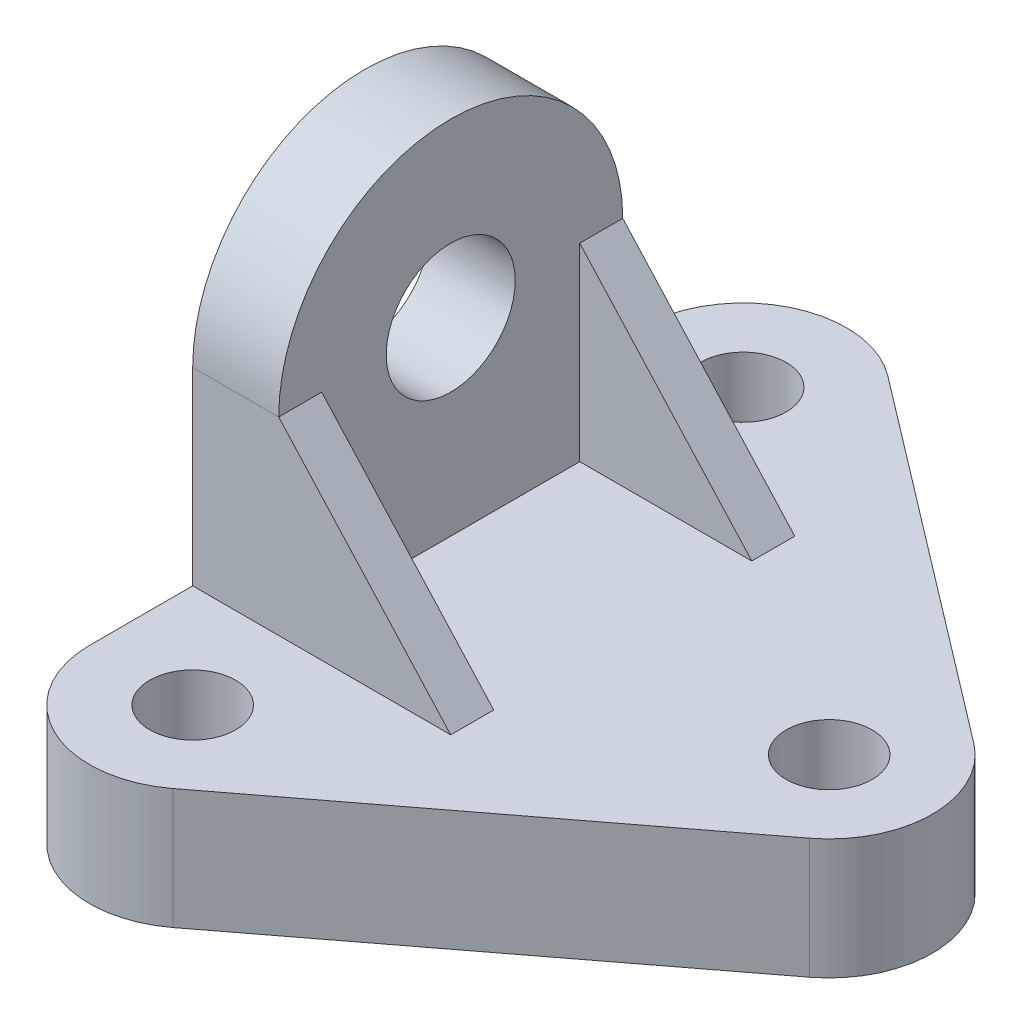
ISO-10303-21;
HEADER;
FILE_DESCRIPTION(('STEP AP214'),'2;1');
FILE_NAME('part.step','',(''),(''),'','','');
FILE_SCHEMA(('AUTOMOTIVE_DESIGN { 1 0 10303 214 1 1 1 1 }'));
ENDSEC;
DATA;
#1=APPLICATION_CONTEXT('core data for automotive mechanical design processes');
#2=APPLICATION_PROTOCOL_DEFINITION('international standard','automotive_design',2000,#1);
#3=PRODUCT_CONTEXT('',#1,'mechanical');
#4=PRODUCT('Part','Part','',(#3));
#5=PRODUCT_RELATED_PRODUCT_CATEGORY('part','',(#4));
#6=PRODUCT_DEFINITION_FORMATION('','',#4);
#7=PRODUCT_DEFINITION_CONTEXT('part definition',#1,'design');
#8=PRODUCT_DEFINITION('design','',#6,#7);
#9=PRODUCT_DEFINITION_SHAPE('','',#8);
#10=(LENGTH_UNIT() NAMED_UNIT(*) SI_UNIT(.MILLI.,.METRE.));
#11=(NAMED_UNIT(*) PLANE_ANGLE_UNIT() SI_UNIT($,.RADIAN.));
#12=(NAMED_UNIT(*) SI_UNIT($,.STERADIAN.) SOLID_ANGLE_UNIT());
#13=UNCERTAINTY_MEASURE_WITH_UNIT(LENGTH_MEASURE(1.E-05),#10,'distance_accuracy_value','');
#14=(GEOMETRIC_REPRESENTATION_CONTEXT(3) GLOBAL_UNCERTAINTY_ASSIGNED_CONTEXT((#13)) GLOBAL_UNIT_ASSIGNED_CONTEXT((#10,
#11,#12)) REPRESENTATION_CONTEXT('',''));
#15=CARTESIAN_POINT('',(0.,0.,0.));
#16=DIRECTION('',(0.,0.,1.));
#17=DIRECTION('',(1.,0.,0.));
#18=AXIS2_PLACEMENT_3D('',#15,#16,#17);
#19=CARTESIAN_POINT('',(-42.,14.,-32.));
#20=DIRECTION('',(0.,1.,0.));
#21=DIRECTION('',(0.,0.,1.));
#22=AXIS2_PLACEMENT_3D('',#19,#20,#21);
#23=PLANE('',#22);
#24=CARTESIAN_POINT('',(0.,14.,0.));
#25=DIRECTION('',(0.,1.,0.));
#26=DIRECTION('',(0.,0.,1.));
#27=AXIS2_PLACEMENT_3D('',#24,#25,#26);
#28=CIRCLE('',#27,5.);
#29=CARTESIAN_POINT('',(0.,14.,5.));
#30=VERTEX_POINT('',#29);
#31=EDGE_CURVE('E238',#30,#30,#28,.T.);
#32=ORIENTED_EDGE('',*,*,#31,.F.);
#33=EDGE_LOOP('',(#32));
#34=FACE_BOUND('',#33,.T.);
#35=CARTESIAN_POINT('',(-42.,14.,-32.));
#36=DIRECTION('',(0.,1.,0.));
#37=DIRECTION('',(0.,0.,1.));
#38=AXIS2_PLACEMENT_3D('',#35,#36,#37);
#39=CIRCLE('',#38,5.);
#40=CARTESIAN_POINT('',(-42.,14.,-27.));
#41=VERTEX_POINT('',#40);
#42=EDGE_CURVE('E246',#41,#41,#39,.T.);
#43=ORIENTED_EDGE('',*,*,#42,.F.);
#44=EDGE_LOOP('',(#43));
#45=FACE_BOUND('',#44,.T.);
#46=CARTESIAN_POINT('',(-42.,14.,32.));
#47=DIRECTION('',(0.,1.,0.));
#48=DIRECTION('',(0.,0.,1.));
#49=AXIS2_PLACEMENT_3D('',#46,#47,#48);
#50=CIRCLE('',#49,5.);
#51=CARTESIAN_POINT('',(-42.,14.,37.));
#52=VERTEX_POINT('',#51);
#53=EDGE_CURVE('E230',#52,#52,#50,.T.);
#54=ORIENTED_EDGE('',*,*,#53,.F.);
#55=EDGE_LOOP('',(#54));
#56=FACE_BOUND('',#55,.T.);
#57=DIRECTION('',(0.,0.,-1.));
#58=VECTOR('',#57,1.);
#59=CARTESIAN_POINT('',(-24.,14.,-15.));
#60=LINE('',#59,#58);
#61=CARTESIAN_POINT('',(-24.,14.,-15.));
#62=VERTEX_POINT('',#61);
#63=CARTESIAN_POINT('',(-24.,14.,-20.));
#64=VERTEX_POINT('',#63);
#65=EDGE_CURVE('E156',#62,#64,#60,.T.);
#66=ORIENTED_EDGE('',*,*,#65,.F.);
#67=DIRECTION('',(-1.,0.,0.));
#68=VECTOR('',#67,1.);
#69=CARTESIAN_POINT('',(-44.,14.,-15.));
#70=LINE('',#69,#68);
#71=CARTESIAN_POINT('',(-44.,14.,-15.));
#72=VERTEX_POINT('',#71);
#73=EDGE_CURVE('E143',#62,#72,#70,.T.);
#74=ORIENTED_EDGE('',*,*,#73,.T.);
#75=DIRECTION('',(0.,0.,-1.));
#76=VECTOR('',#75,1.);
#77=CARTESIAN_POINT('',(-44.,14.,-20.));
#78=LINE('',#77,#76);
#79=CARTESIAN_POINT('',(-44.,14.,15.));
#80=VERTEX_POINT('',#79);
#81=EDGE_CURVE('E218',#80,#72,#78,.T.);
#82=ORIENTED_EDGE('',*,*,#81,.F.);
#83=DIRECTION('',(1.,0.,0.));
#84=VECTOR('',#83,1.);
#85=CARTESIAN_POINT('',(-24.,14.,15.));
#86=LINE('',#85,#84);
#87=CARTESIAN_POINT('',(-24.,14.,15.));
#88=VERTEX_POINT('',#87);
#89=EDGE_CURVE('E61',#80,#88,#86,.T.);
#90=ORIENTED_EDGE('',*,*,#89,.T.);
#91=DIRECTION('',(0.,0.,1.));
#92=VECTOR('',#91,1.);
#93=CARTESIAN_POINT('',(-24.,14.,15.));
#94=LINE('',#93,#92);
#95=CARTESIAN_POINT('',(-24.,14.,20.));
#96=VERTEX_POINT('',#95);
#97=EDGE_CURVE('E183',#88,#96,#94,.T.);
#98=ORIENTED_EDGE('',*,*,#97,.T.);
#99=DIRECTION('',(1.,0.,0.));
#100=VECTOR('',#99,1.);
#101=CARTESIAN_POINT('',(-54.,14.,20.));
#102=LINE('',#101,#100);
#103=CARTESIAN_POINT('',(-54.,14.,20.));
#104=VERTEX_POINT('',#103);
#105=EDGE_CURVE('E69',#104,#96,#102,.T.);
#106=ORIENTED_EDGE('',*,*,#105,.F.);
#107=DIRECTION('',(0.,0.,1.));
#108=VECTOR('',#107,1.);
#109=CARTESIAN_POINT('',(-54.,14.,-32.));
#110=LINE('',#109,#108);
#111=CARTESIAN_POINT('',(-54.,14.,32.));
#112=VERTEX_POINT('',#111);
#113=EDGE_CURVE('E258',#104,#112,#110,.T.);
#114=ORIENTED_EDGE('',*,*,#113,.T.);
#115=CARTESIAN_POINT('',(-42.,14.,32.));
#116=DIRECTION('',(0.,1.,0.));
#117=DIRECTION('',(0.,0.,-1.));
#118=AXIS2_PLACEMENT_3D('',#115,#116,#117);
#119=CIRCLE('',#118,12.);
#120=CARTESIAN_POINT('',(-34.7274814168457,14.,41.54518064039));
#121=VERTEX_POINT('',#120);
#122=EDGE_CURVE('E263',#112,#121,#119,.T.);
#123=ORIENTED_EDGE('',*,*,#122,.T.);
#124=DIRECTION('',(0.795431720032499,0.,-0.606043215262856));
#125=VECTOR('',#124,1.);
#126=CARTESIAN_POINT('',(-34.7274814168457,14.,41.54518064039));
#127=LINE('',#126,#125);
#128=CARTESIAN_POINT('',(7.27251858315427,14.,9.54518064038998));
#129=VERTEX_POINT('',#128);
#130=EDGE_CURVE('E266',#121,#129,#127,.T.);
#131=ORIENTED_EDGE('',*,*,#130,.T.);
#132=CARTESIAN_POINT('',(0.,14.,0.));
#133=DIRECTION('',(0.,1.,0.));
#134=DIRECTION('',(0.,0.,1.));
#135=AXIS2_PLACEMENT_3D('',#132,#133,#134);
#136=CIRCLE('',#135,12.);
#137=CARTESIAN_POINT('',(7.27251858315428,14.,-9.54518064038998));
#138=VERTEX_POINT('',#137);
#139=EDGE_CURVE('E269',#129,#138,#136,.T.);
#140=ORIENTED_EDGE('',*,*,#139,.T.);
#141=DIRECTION('',(-0.795431720032499,0.,-0.606043215262856));
#142=VECTOR('',#141,1.);
#143=CARTESIAN_POINT('',(-34.7274814168457,14.,-41.54518064039));
#144=LINE('',#143,#142);
#145=CARTESIAN_POINT('',(-34.7274814168457,14.,-41.54518064039));
#146=VERTEX_POINT('',#145);
#147=EDGE_CURVE('E272',#138,#146,#144,.T.);
#148=ORIENTED_EDGE('',*,*,#147,.T.);
#149=CARTESIAN_POINT('',(-42.,14.,-32.));
#150=DIRECTION('',(0.,1.,0.));
#151=DIRECTION('',(0.,0.,1.));
#152=AXIS2_PLACEMENT_3D('',#149,#150,#151);
#153=CIRCLE('',#152,12.);
#154=CARTESIAN_POINT('',(-54.,14.,-32.));
#155=VERTEX_POINT('',#154);
#156=EDGE_CURVE('E254',#146,#155,#153,.T.);
#157=ORIENTED_EDGE('',*,*,#156,.T.);
#158=CARTESIAN_POINT('',(-54.,14.,-20.));
#159=VERTEX_POINT('',#158);
#160=EDGE_CURVE('E260',#155,#159,#110,.T.);
#161=ORIENTED_EDGE('',*,*,#160,.T.);
#162=DIRECTION('',(-1.,0.,0.));
#163=VECTOR('',#162,1.);
#164=CARTESIAN_POINT('',(-54.,14.,-20.));
#165=LINE('',#164,#163);
#166=EDGE_CURVE('E164',#64,#159,#165,.T.);
#167=ORIENTED_EDGE('',*,*,#166,.F.);
#168=EDGE_LOOP('',(#66,#74,#82,#90,#98,#106,#114,#123,#131,#140,#148,#157,#161,#167));
#169=FACE_BOUND('',#168,.T.);
#170=ADVANCED_FACE('F45',(#34,#45,#56,#169),#23,.T.);
#171=CARTESIAN_POINT('',(-42.,0.,-32.));
#172=DIRECTION('',(0.,1.,0.));
#173=DIRECTION('',(0.,0.,1.));
#174=AXIS2_PLACEMENT_3D('',#171,#172,#173);
#175=PLANE('',#174);
#176=CARTESIAN_POINT('',(-42.,0.,-32.));
#177=DIRECTION('',(0.,1.,0.));
#178=DIRECTION('',(0.,0.,1.));
#179=AXIS2_PLACEMENT_3D('',#176,#177,#178);
#180=CIRCLE('',#179,12.);
#181=CARTESIAN_POINT('',(-34.7274814168457,0.,-41.54518064039));
#182=VERTEX_POINT('',#181);
#183=CARTESIAN_POINT('',(-54.,0.,-32.));
#184=VERTEX_POINT('',#183);
#185=EDGE_CURVE('E250',#182,#184,#180,.T.);
#186=ORIENTED_EDGE('',*,*,#185,.F.);
#187=DIRECTION('',(-0.795431720032499,0.,-0.606043215262856));
#188=VECTOR('',#187,1.);
#189=CARTESIAN_POINT('',(-34.7274814168457,0.,-41.54518064039));
#190=LINE('',#189,#188);
#191=CARTESIAN_POINT('',(7.27251858315428,0.,-9.54518064038998));
#192=VERTEX_POINT('',#191);
#193=EDGE_CURVE('E259',#192,#182,#190,.T.);
#194=ORIENTED_EDGE('',*,*,#193,.F.);
#195=CARTESIAN_POINT('',(0.,0.,0.));
#196=DIRECTION('',(0.,1.,0.));
#197=DIRECTION('',(0.,0.,1.));
#198=AXIS2_PLACEMENT_3D('',#195,#196,#197);
#199=CIRCLE('',#198,12.);
#200=CARTESIAN_POINT('',(7.27251858315427,0.,9.54518064038998));
#201=VERTEX_POINT('',#200);
#202=EDGE_CURVE('E288',#201,#192,#199,.T.);
#203=ORIENTED_EDGE('',*,*,#202,.F.);
#204=DIRECTION('',(0.795431720032499,0.,-0.606043215262856));
#205=VECTOR('',#204,1.);
#206=CARTESIAN_POINT('',(-34.7274814168457,0.,41.54518064039));
#207=LINE('',#206,#205);
#208=CARTESIAN_POINT('',(-34.7274814168457,0.,41.54518064039));
#209=VERTEX_POINT('',#208);
#210=EDGE_CURVE('E285',#209,#201,#207,.T.);
#211=ORIENTED_EDGE('',*,*,#210,.F.);
#212=CARTESIAN_POINT('',(-42.,0.,32.));
#213=DIRECTION('',(0.,1.,0.));
#214=DIRECTION('',(0.,0.,-1.));
#215=AXIS2_PLACEMENT_3D('',#212,#213,#214);
#216=CIRCLE('',#215,12.);
#217=CARTESIAN_POINT('',(-54.,0.,32.));
#218=VERTEX_POINT('',#217);
#219=EDGE_CURVE('E282',#218,#209,#216,.T.);
#220=ORIENTED_EDGE('',*,*,#219,.F.);
#221=DIRECTION('',(0.,0.,1.));
#222=VECTOR('',#221,1.);
#223=CARTESIAN_POINT('',(-54.,0.,-32.));
#224=LINE('',#223,#222);
#225=EDGE_CURVE('E279',#184,#218,#224,.T.);
#226=ORIENTED_EDGE('',*,*,#225,.F.);
#227=EDGE_LOOP('',(#186,#194,#203,#211,#220,#226));
#228=FACE_BOUND('',#227,.T.);
#229=CARTESIAN_POINT('',(-42.,0.,-32.));
#230=DIRECTION('',(0.,1.,0.));
#231=DIRECTION('',(0.,0.,1.));
#232=AXIS2_PLACEMENT_3D('',#229,#230,#231);
#233=CIRCLE('',#232,5.);
#234=CARTESIAN_POINT('',(-42.,0.,-27.));
#235=VERTEX_POINT('',#234);
#236=EDGE_CURVE('E242',#235,#235,#233,.T.);
#237=ORIENTED_EDGE('',*,*,#236,.T.);
#238=EDGE_LOOP('',(#237));
#239=FACE_BOUND('',#238,.T.);
#240=CARTESIAN_POINT('',(0.,0.,0.));
#241=DIRECTION('',(0.,1.,0.));
#242=DIRECTION('',(0.,0.,1.));
#243=AXIS2_PLACEMENT_3D('',#240,#241,#242);
#244=CIRCLE('',#243,5.);
#245=CARTESIAN_POINT('',(0.,0.,5.));
#246=VERTEX_POINT('',#245);
#247=EDGE_CURVE('E234',#246,#246,#244,.T.);
#248=ORIENTED_EDGE('',*,*,#247,.T.);
#249=EDGE_LOOP('',(#248));
#250=FACE_BOUND('',#249,.T.);
#251=CARTESIAN_POINT('',(-42.,0.,32.));
#252=DIRECTION('',(0.,1.,0.));
#253=DIRECTION('',(0.,0.,1.));
#254=AXIS2_PLACEMENT_3D('',#251,#252,#253);
#255=CIRCLE('',#254,5.);
#256=CARTESIAN_POINT('',(-42.,0.,37.));
#257=VERTEX_POINT('',#256);
#258=EDGE_CURVE('E229',#257,#257,#255,.T.);
#259=ORIENTED_EDGE('',*,*,#258,.T.);
#260=EDGE_LOOP('',(#259));
#261=FACE_BOUND('',#260,.T.);
#262=ADVANCED_FACE('F320',(#228,#239,#250,#261),#175,.F.);
#263=CARTESIAN_POINT('',(-42.,14.,-32.));
#264=DIRECTION('',(0.,-1.,0.));
#265=DIRECTION('',(0.,0.,-1.));
#266=AXIS2_PLACEMENT_3D('',#263,#264,#265);
#267=CYLINDRICAL_SURFACE('',#266,12.);
#268=ORIENTED_EDGE('',*,*,#185,.T.);
#269=DIRECTION('',(0.,-1.,0.));
#270=VECTOR('',#269,1.);
#271=CARTESIAN_POINT('',(-54.,14.,-32.));
#272=LINE('',#271,#270);
#273=EDGE_CURVE('E11',#155,#184,#272,.T.);
#274=ORIENTED_EDGE('',*,*,#273,.F.);
#275=ORIENTED_EDGE('',*,*,#156,.F.);
#276=DIRECTION('',(0.,-1.,0.));
#277=VECTOR('',#276,1.);
#278=CARTESIAN_POINT('',(-34.7274814168457,14.,-41.54518064039));
#279=LINE('',#278,#277);
#280=EDGE_CURVE('E275',#146,#182,#279,.T.);
#281=ORIENTED_EDGE('',*,*,#280,.T.);
#282=EDGE_LOOP('',(#268,#274,#275,#281));
#283=FACE_BOUND('',#282,.T.);
#284=ADVANCED_FACE('F47',(#283),#267,.T.);
#285=CARTESIAN_POINT('',(-54.,14.,-32.));
#286=DIRECTION('',(1.,0.,0.));
#287=DIRECTION('',(0.,0.,-1.));
#288=AXIS2_PLACEMENT_3D('',#285,#286,#287);
#289=PLANE('',#288);
#290=CARTESIAN_POINT('',(-54.,36.,0.));
#291=DIRECTION('',(1.,0.,0.));
#292=DIRECTION('',(0.,0.,-1.));
#293=AXIS2_PLACEMENT_3D('',#290,#291,#292);
#294=CIRCLE('',#293,7.50000000000001);
#295=CARTESIAN_POINT('',(-54.,36.,-7.50000000000001));
#296=VERTEX_POINT('',#295);
#297=EDGE_CURVE('E196',#296,#296,#294,.T.);
#298=ORIENTED_EDGE('',*,*,#297,.T.);
#299=EDGE_LOOP('',(#298));
#300=FACE_BOUND('',#299,.T.);
#301=DIRECTION('',(0.,-1.,0.));
#302=VECTOR('',#301,1.);
#303=CARTESIAN_POINT('',(-54.,36.,20.));
#304=LINE('',#303,#302);
#305=CARTESIAN_POINT('',(-54.,36.,20.));
#306=VERTEX_POINT('',#305);
#307=EDGE_CURVE('E226',#306,#104,#304,.T.);
#308=ORIENTED_EDGE('',*,*,#307,.F.);
#309=CARTESIAN_POINT('',(-54.,36.,0.));
#310=DIRECTION('',(-1.,0.,0.));
#311=DIRECTION('',(0.,0.,1.));
#312=AXIS2_PLACEMENT_3D('',#309,#310,#311);
#313=CIRCLE('',#312,20.);
#314=CARTESIAN_POINT('',(-54.,36.,-20.));
#315=VERTEX_POINT('',#314);
#316=EDGE_CURVE('E200',#306,#315,#313,.T.);
#317=ORIENTED_EDGE('',*,*,#316,.T.);
#318=DIRECTION('',(0.,-1.,0.));
#319=VECTOR('',#318,1.);
#320=CARTESIAN_POINT('',(-54.,36.,-20.));
#321=LINE('',#320,#319);
#322=EDGE_CURVE('E215',#315,#159,#321,.T.);
#323=ORIENTED_EDGE('',*,*,#322,.T.);
#324=ORIENTED_EDGE('',*,*,#160,.F.);
#325=ORIENTED_EDGE('',*,*,#273,.T.);
#326=ORIENTED_EDGE('',*,*,#225,.T.);
#327=DIRECTION('',(0.,-1.,0.));
#328=VECTOR('',#327,1.);
#329=CARTESIAN_POINT('',(-54.,14.,32.));
#330=LINE('',#329,#328);
#331=EDGE_CURVE('E54',#112,#218,#330,.T.);
#332=ORIENTED_EDGE('',*,*,#331,.F.);
#333=ORIENTED_EDGE('',*,*,#113,.F.);
#334=EDGE_LOOP('',(#308,#317,#323,#324,#325,#326,#332,#333));
#335=FACE_BOUND('',#334,.T.);
#336=ADVANCED_FACE('F336',(#300,#335),#289,.F.);
#337=CARTESIAN_POINT('',(-42.,14.,32.));
#338=DIRECTION('',(0.,-1.,0.));
#339=DIRECTION('',(0.,0.,-1.));
#340=AXIS2_PLACEMENT_3D('',#337,#338,#339);
#341=CYLINDRICAL_SURFACE('',#340,12.);
#342=ORIENTED_EDGE('',*,*,#219,.T.);
#343=DIRECTION('',(0.,-1.,0.));
#344=VECTOR('',#343,1.);
#345=CARTESIAN_POINT('',(-34.7274814168457,14.,41.54518064039));
#346=LINE('',#345,#344);
#347=EDGE_CURVE('E304',#121,#209,#346,.T.);
#348=ORIENTED_EDGE('',*,*,#347,.F.);
#349=ORIENTED_EDGE('',*,*,#122,.F.);
#350=ORIENTED_EDGE('',*,*,#331,.T.);
#351=EDGE_LOOP('',(#342,#348,#349,#350));
#352=FACE_BOUND('',#351,.T.);
#353=ADVANCED_FACE('F313',(#352),#341,.T.);
#354=CARTESIAN_POINT('',(-34.7274814168457,14.,41.54518064039));
#355=DIRECTION('',(-0.606043215262856,0.,-0.795431720032499));
#356=DIRECTION('',(-0.795431720032499,0.,0.606043215262856));
#357=AXIS2_PLACEMENT_3D('',#354,#355,#356);
#358=PLANE('',#357);
#359=ORIENTED_EDGE('',*,*,#210,.T.);
#360=DIRECTION('',(0.,-1.,0.));
#361=VECTOR('',#360,1.);
#362=CARTESIAN_POINT('',(7.27251858315427,14.,9.54518064038998));
#363=LINE('',#362,#361);
#364=EDGE_CURVE('E300',#129,#201,#363,.T.);
#365=ORIENTED_EDGE('',*,*,#364,.F.);
#366=ORIENTED_EDGE('',*,*,#130,.F.);
#367=ORIENTED_EDGE('',*,*,#347,.T.);
#368=EDGE_LOOP('',(#359,#365,#366,#367));
#369=FACE_BOUND('',#368,.T.);
#370=ADVANCED_FACE('F326',(#369),#358,.F.);
#371=CARTESIAN_POINT('',(0.,14.,0.));
#372=DIRECTION('',(0.,-1.,0.));
#373=DIRECTION('',(0.,0.,-1.));
#374=AXIS2_PLACEMENT_3D('',#371,#372,#373);
#375=CYLINDRICAL_SURFACE('',#374,12.);
#376=ORIENTED_EDGE('',*,*,#202,.T.);
#377=DIRECTION('',(0.,-1.,0.));
#378=VECTOR('',#377,1.);
#379=CARTESIAN_POINT('',(7.27251858315428,14.,-9.54518064038998));
#380=LINE('',#379,#378);
#381=EDGE_CURVE('E296',#138,#192,#380,.T.);
#382=ORIENTED_EDGE('',*,*,#381,.F.);
#383=ORIENTED_EDGE('',*,*,#139,.F.);
#384=ORIENTED_EDGE('',*,*,#364,.T.);
#385=EDGE_LOOP('',(#376,#382,#383,#384));
#386=FACE_BOUND('',#385,.T.);
#387=ADVANCED_FACE('F330',(#386),#375,.T.);
#388=CARTESIAN_POINT('',(-34.7274814168457,14.,-41.54518064039));
#389=DIRECTION('',(-0.606043215262856,0.,0.795431720032499));
#390=DIRECTION('',(0.795431720032499,0.,0.606043215262856));
#391=AXIS2_PLACEMENT_3D('',#388,#389,#390);
#392=PLANE('',#391);
#393=ORIENTED_EDGE('',*,*,#193,.T.);
#394=ORIENTED_EDGE('',*,*,#280,.F.);
#395=ORIENTED_EDGE('',*,*,#147,.F.);
#396=ORIENTED_EDGE('',*,*,#381,.T.);
#397=EDGE_LOOP('',(#393,#394,#395,#396));
#398=FACE_BOUND('',#397,.T.);
#399=ADVANCED_FACE('F375',(#398),#392,.F.);
#400=CARTESIAN_POINT('',(-42.,14.,-32.));
#401=DIRECTION('',(0.,-1.,0.));
#402=DIRECTION('',(0.,0.,-1.));
#403=AXIS2_PLACEMENT_3D('',#400,#401,#402);
#404=CYLINDRICAL_SURFACE('',#403,5.);
#405=ORIENTED_EDGE('',*,*,#42,.T.);
#406=EDGE_LOOP('',(#405));
#407=FACE_BOUND('',#406,.T.);
#408=ORIENTED_EDGE('',*,*,#236,.F.);
#409=EDGE_LOOP('',(#408));
#410=FACE_BOUND('',#409,.T.);
#411=ADVANCED_FACE('F372',(#407,#410),#404,.F.);
#412=CARTESIAN_POINT('',(0.,14.,0.));
#413=DIRECTION('',(0.,-1.,0.));
#414=DIRECTION('',(0.,0.,-1.));
#415=AXIS2_PLACEMENT_3D('',#412,#413,#414);
#416=CYLINDRICAL_SURFACE('',#415,5.);
#417=ORIENTED_EDGE('',*,*,#31,.T.);
#418=EDGE_LOOP('',(#417));
#419=FACE_BOUND('',#418,.T.);
#420=ORIENTED_EDGE('',*,*,#247,.F.);
#421=EDGE_LOOP('',(#420));
#422=FACE_BOUND('',#421,.T.);
#423=ADVANCED_FACE('F410',(#419,#422),#416,.F.);
#424=CARTESIAN_POINT('',(-42.,14.,32.));
#425=DIRECTION('',(0.,-1.,0.));
#426=DIRECTION('',(0.,0.,-1.));
#427=AXIS2_PLACEMENT_3D('',#424,#425,#426);
#428=CYLINDRICAL_SURFACE('',#427,5.);
#429=ORIENTED_EDGE('',*,*,#53,.T.);
#430=EDGE_LOOP('',(#429));
#431=FACE_BOUND('',#430,.T.);
#432=ORIENTED_EDGE('',*,*,#258,.F.);
#433=EDGE_LOOP('',(#432));
#434=FACE_BOUND('',#433,.T.);
#435=ADVANCED_FACE('F406',(#431,#434),#428,.F.);
#436=CARTESIAN_POINT('',(-54.,36.,20.));
#437=DIRECTION('',(0.,0.,-1.));
#438=DIRECTION('',(-1.,0.,0.));
#439=AXIS2_PLACEMENT_3D('',#436,#437,#438);
#440=PLANE('',#439);
#441=ORIENTED_EDGE('',*,*,#105,.T.);
#442=DIRECTION('',(-0.672672793996313,0.739940073395944,0.));
#443=VECTOR('',#442,1.);
#444=CARTESIAN_POINT('',(-44.,36.,20.));
#445=LINE('',#444,#443);
#446=CARTESIAN_POINT('',(-44.,36.,20.));
#447=VERTEX_POINT('',#446);
#448=EDGE_CURVE('E169',#96,#447,#445,.T.);
#449=ORIENTED_EDGE('',*,*,#448,.T.);
#450=DIRECTION('',(1.,0.,0.));
#451=VECTOR('',#450,1.);
#452=CARTESIAN_POINT('',(-54.,36.,20.));
#453=LINE('',#452,#451);
#454=EDGE_CURVE('E208',#306,#447,#453,.T.);
#455=ORIENTED_EDGE('',*,*,#454,.F.);
#456=ORIENTED_EDGE('',*,*,#307,.T.);
#457=EDGE_LOOP('',(#441,#449,#455,#456));
#458=FACE_BOUND('',#457,.T.);
#459=ADVANCED_FACE('F338',(#458),#440,.F.);
#460=CARTESIAN_POINT('',(-44.,36.,-20.));
#461=DIRECTION('',(-1.,0.,0.));
#462=DIRECTION('',(0.,0.,1.));
#463=AXIS2_PLACEMENT_3D('',#460,#461,#462);
#464=PLANE('',#463);
#465=CARTESIAN_POINT('',(-44.,36.,0.));
#466=DIRECTION('',(1.,0.,0.));
#467=DIRECTION('',(0.,0.,-1.));
#468=AXIS2_PLACEMENT_3D('',#465,#466,#467);
#469=CIRCLE('',#468,7.50000000000001);
#470=CARTESIAN_POINT('',(-44.,36.,-7.50000000000001));
#471=VERTEX_POINT('',#470);
#472=EDGE_CURVE('E190',#471,#471,#469,.T.);
#473=ORIENTED_EDGE('',*,*,#472,.F.);
#474=EDGE_LOOP('',(#473));
#475=FACE_BOUND('',#474,.T.);
#476=DIRECTION('',(0.,1.,0.));
#477=VECTOR('',#476,1.);
#478=CARTESIAN_POINT('',(-44.,36.,-15.));
#479=LINE('',#478,#477);
#480=CARTESIAN_POINT('',(-44.,36.,-15.));
#481=VERTEX_POINT('',#480);
#482=EDGE_CURVE('E148',#72,#481,#479,.T.);
#483=ORIENTED_EDGE('',*,*,#482,.T.);
#484=DIRECTION('',(0.,0.,-1.));
#485=VECTOR('',#484,1.);
#486=CARTESIAN_POINT('',(-44.,36.,-15.));
#487=LINE('',#486,#485);
#488=CARTESIAN_POINT('',(-44.,36.,-20.));
#489=VERTEX_POINT('',#488);
#490=EDGE_CURVE('E159',#481,#489,#487,.T.);
#491=ORIENTED_EDGE('',*,*,#490,.T.);
#492=CARTESIAN_POINT('',(-44.,36.,0.));
#493=DIRECTION('',(-1.,0.,0.));
#494=DIRECTION('',(0.,0.,1.));
#495=AXIS2_PLACEMENT_3D('',#492,#493,#494);
#496=CIRCLE('',#495,20.);
#497=EDGE_CURVE('E204',#489,#447,#496,.F.);
#498=ORIENTED_EDGE('',*,*,#497,.T.);
#499=DIRECTION('',(0.,0.,1.));
#500=VECTOR('',#499,1.);
#501=CARTESIAN_POINT('',(-44.,36.,15.));
#502=LINE('',#501,#500);
#503=CARTESIAN_POINT('',(-44.,36.,15.));
#504=VERTEX_POINT('',#503);
#505=EDGE_CURVE('E186',#504,#447,#502,.T.);
#506=ORIENTED_EDGE('',*,*,#505,.F.);
#507=DIRECTION('',(0.,-1.,0.));
#508=VECTOR('',#507,1.);
#509=CARTESIAN_POINT('',(-44.,14.,15.));
#510=LINE('',#509,#508);
#511=EDGE_CURVE('E174',#504,#80,#510,.T.);
#512=ORIENTED_EDGE('',*,*,#511,.T.);
#513=ORIENTED_EDGE('',*,*,#81,.T.);
#514=EDGE_LOOP('',(#483,#491,#498,#506,#512,#513));
#515=FACE_BOUND('',#514,.T.);
#516=ADVANCED_FACE('F344',(#475,#515),#464,.F.);
#517=CARTESIAN_POINT('',(-54.,36.,-20.));
#518=DIRECTION('',(0.,0.,1.));
#519=DIRECTION('',(1.,0.,0.));
#520=AXIS2_PLACEMENT_3D('',#517,#518,#519);
#521=PLANE('',#520);
#522=ORIENTED_EDGE('',*,*,#166,.T.);
#523=ORIENTED_EDGE('',*,*,#322,.F.);
#524=DIRECTION('',(-1.,0.,0.));
#525=VECTOR('',#524,1.);
#526=CARTESIAN_POINT('',(-54.,36.,-20.));
#527=LINE('',#526,#525);
#528=EDGE_CURVE('E211',#489,#315,#527,.T.);
#529=ORIENTED_EDGE('',*,*,#528,.F.);
#530=DIRECTION('',(0.672672793996313,-0.739940073395944,0.));
#531=VECTOR('',#530,1.);
#532=CARTESIAN_POINT('',(-24.,14.,-20.));
#533=LINE('',#532,#531);
#534=EDGE_CURVE('E161',#489,#64,#533,.T.);
#535=ORIENTED_EDGE('',*,*,#534,.T.);
#536=EDGE_LOOP('',(#522,#523,#529,#535));
#537=FACE_BOUND('',#536,.T.);
#538=ADVANCED_FACE('F398',(#537),#521,.F.);
#539=CARTESIAN_POINT('',(12.5685424949238,36.,0.));
#540=DIRECTION('',(-1.,0.,0.));
#541=DIRECTION('',(0.,0.,1.));
#542=AXIS2_PLACEMENT_3D('',#539,#540,#541);
#543=CYLINDRICAL_SURFACE('',#542,20.);
#544=ORIENTED_EDGE('',*,*,#497,.F.);
#545=ORIENTED_EDGE('',*,*,#528,.T.);
#546=ORIENTED_EDGE('',*,*,#316,.F.);
#547=ORIENTED_EDGE('',*,*,#454,.T.);
#548=EDGE_LOOP('',(#544,#545,#546,#547));
#549=FACE_BOUND('',#548,.T.);
#550=ADVANCED_FACE('F342',(#549),#543,.T.);
#551=CARTESIAN_POINT('',(-44.,36.,0.));
#552=DIRECTION('',(1.,0.,0.));
#553=DIRECTION('',(0.,0.,-1.));
#554=AXIS2_PLACEMENT_3D('',#551,#552,#553);
#555=CYLINDRICAL_SURFACE('',#554,7.50000000000001);
#556=ORIENTED_EDGE('',*,*,#297,.F.);
#557=EDGE_LOOP('',(#556));
#558=FACE_BOUND('',#557,.T.);
#559=ORIENTED_EDGE('',*,*,#472,.T.);
#560=EDGE_LOOP('',(#559));
#561=FACE_BOUND('',#560,.T.);
#562=ADVANCED_FACE('F360',(#558,#561),#555,.F.);
#563=CARTESIAN_POINT('',(-44.,36.,15.));
#564=DIRECTION('',(0.739940073395944,0.672672793996313,0.));
#565=DIRECTION('',(-0.672672793996313,0.739940073395944,0.));
#566=AXIS2_PLACEMENT_3D('',#563,#564,#565);
#567=PLANE('',#566);
#568=ORIENTED_EDGE('',*,*,#448,.F.);
#569=ORIENTED_EDGE('',*,*,#97,.F.);
#570=DIRECTION('',(-0.672672793996313,0.739940073395944,0.));
#571=VECTOR('',#570,1.);
#572=CARTESIAN_POINT('',(-44.,36.,15.));
#573=LINE('',#572,#571);
#574=EDGE_CURVE('E179',#88,#504,#573,.T.);
#575=ORIENTED_EDGE('',*,*,#574,.T.);
#576=ORIENTED_EDGE('',*,*,#505,.T.);
#577=EDGE_LOOP('',(#568,#569,#575,#576));
#578=FACE_BOUND('',#577,.T.);
#579=ADVANCED_FACE('F348',(#578),#567,.T.);
#580=CARTESIAN_POINT('',(0.,0.,15.));
#581=DIRECTION('',(0.,0.,1.));
#582=DIRECTION('',(1.,0.,0.));
#583=AXIS2_PLACEMENT_3D('',#580,#581,#582);
#584=PLANE('',#583);
#585=ORIENTED_EDGE('',*,*,#511,.F.);
#586=ORIENTED_EDGE('',*,*,#574,.F.);
#587=ORIENTED_EDGE('',*,*,#89,.F.);
#588=EDGE_LOOP('',(#585,#586,#587));
#589=FACE_BOUND('',#588,.T.);
#590=ADVANCED_FACE('F351',(#589),#584,.F.);
#591=CARTESIAN_POINT('',(-24.,14.,-15.));
#592=DIRECTION('',(0.739940073395944,0.672672793996313,0.));
#593=DIRECTION('',(-0.672672793996313,0.739940073395944,0.));
#594=AXIS2_PLACEMENT_3D('',#591,#592,#593);
#595=PLANE('',#594);
#596=ORIENTED_EDGE('',*,*,#534,.F.);
#597=ORIENTED_EDGE('',*,*,#490,.F.);
#598=DIRECTION('',(0.672672793996313,-0.739940073395944,0.));
#599=VECTOR('',#598,1.);
#600=CARTESIAN_POINT('',(-24.,14.,-15.));
#601=LINE('',#600,#599);
#602=EDGE_CURVE('E146',#481,#62,#601,.T.);
#603=ORIENTED_EDGE('',*,*,#602,.T.);
#604=ORIENTED_EDGE('',*,*,#65,.T.);
#605=EDGE_LOOP('',(#596,#597,#603,#604));
#606=FACE_BOUND('',#605,.T.);
#607=ADVANCED_FACE('F155',(#606),#595,.T.);
#608=CARTESIAN_POINT('',(0.,0.,-15.));
#609=DIRECTION('',(0.,0.,-1.));
#610=DIRECTION('',(-1.,0.,0.));
#611=AXIS2_PLACEMENT_3D('',#608,#609,#610);
#612=PLANE('',#611);
#613=ORIENTED_EDGE('',*,*,#602,.F.);
#614=ORIENTED_EDGE('',*,*,#482,.F.);
#615=ORIENTED_EDGE('',*,*,#73,.F.);
#616=EDGE_LOOP('',(#613,#614,#615));
#617=FACE_BOUND('',#616,.T.);
#618=ADVANCED_FACE('F145',(#617),#612,.F.);
#619=CLOSED_SHELL('',(#170,#262,#284,#336,#353,#370,#387,#399,#411,#423,#435,#459,#516,#538,
#550,#562,#579,#590,#607,#618));
#620=MANIFOLD_SOLID_BREP('B2',#619);
#621=ADVANCED_BREP_SHAPE_REPRESENTATION('',(#18,#620),#14);
#622=SHAPE_DEFINITION_REPRESENTATION(#9,#621);
ENDSEC;
END-ISO-10303-21;
